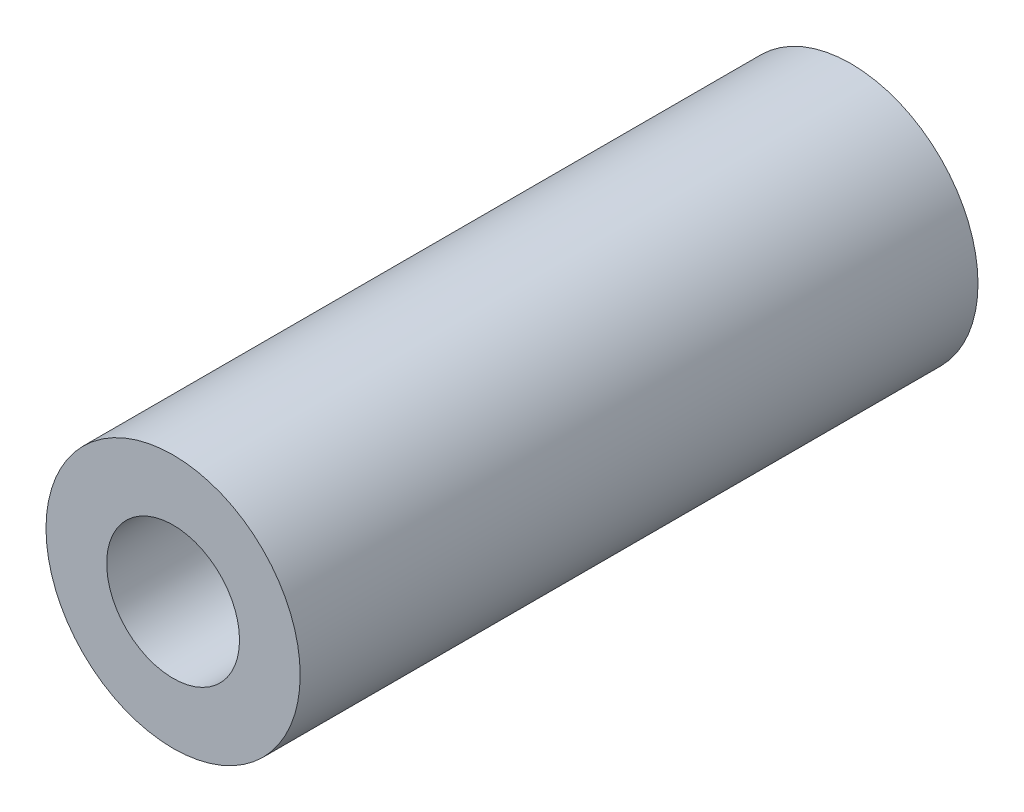
ISO-10303-21;
HEADER;
FILE_DESCRIPTION(('STEP AP214'),'2;1');
FILE_NAME('part.step','',(''),(''),'','','');
FILE_SCHEMA(('AUTOMOTIVE_DESIGN { 1 0 10303 214 1 1 1 1 }'));
ENDSEC;
DATA;
#1=APPLICATION_CONTEXT('core data for automotive mechanical design processes');
#2=APPLICATION_PROTOCOL_DEFINITION('international standard','automotive_design',2000,#1);
#3=PRODUCT_CONTEXT('',#1,'mechanical');
#4=PRODUCT('Part','Part','',(#3));
#5=PRODUCT_RELATED_PRODUCT_CATEGORY('part','',(#4));
#6=PRODUCT_DEFINITION_FORMATION('','',#4);
#7=PRODUCT_DEFINITION_CONTEXT('part definition',#1,'design');
#8=PRODUCT_DEFINITION('design','',#6,#7);
#9=PRODUCT_DEFINITION_SHAPE('','',#8);
#10=(LENGTH_UNIT() NAMED_UNIT(*) SI_UNIT(.MILLI.,.METRE.));
#11=(NAMED_UNIT(*) PLANE_ANGLE_UNIT() SI_UNIT($,.RADIAN.));
#12=(NAMED_UNIT(*) SI_UNIT($,.STERADIAN.) SOLID_ANGLE_UNIT());
#13=UNCERTAINTY_MEASURE_WITH_UNIT(LENGTH_MEASURE(1.E-05),#10,'distance_accuracy_value','');
#14=(GEOMETRIC_REPRESENTATION_CONTEXT(3) GLOBAL_UNCERTAINTY_ASSIGNED_CONTEXT((#13)) GLOBAL_UNIT_ASSIGNED_CONTEXT((#10,
#11,#12)) REPRESENTATION_CONTEXT('',''));
#15=CARTESIAN_POINT('',(0.,0.,0.));
#16=DIRECTION('',(0.,0.,1.));
#17=DIRECTION('',(1.,0.,0.));
#18=AXIS2_PLACEMENT_3D('',#15,#16,#17);
#19=CARTESIAN_POINT('',(0.,0.,25.4));
#20=DIRECTION('',(0.,0.,-1.));
#21=DIRECTION('',(-1.,0.,0.));
#22=AXIS2_PLACEMENT_3D('',#19,#20,#21);
#23=CYLINDRICAL_SURFACE('',#22,2.4892);
#24=CARTESIAN_POINT('',(0.,0.,25.4));
#25=DIRECTION('',(0.,0.,1.));
#26=DIRECTION('',(1.,0.,0.));
#27=AXIS2_PLACEMENT_3D('',#24,#25,#26);
#28=CIRCLE('',#27,2.4892);
#29=CARTESIAN_POINT('',(2.4892,0.,25.4));
#30=VERTEX_POINT('',#29);
#31=EDGE_CURVE('E53',#30,#30,#28,.T.);
#32=ORIENTED_EDGE('',*,*,#31,.T.);
#33=EDGE_LOOP('',(#32));
#34=FACE_BOUND('',#33,.T.);
#35=CARTESIAN_POINT('',(0.,0.,0.));
#36=DIRECTION('',(0.,0.,1.));
#37=DIRECTION('',(1.,0.,0.));
#38=AXIS2_PLACEMENT_3D('',#35,#36,#37);
#39=CIRCLE('',#38,2.4892);
#40=CARTESIAN_POINT('',(2.4892,0.,0.));
#41=VERTEX_POINT('',#40);
#42=EDGE_CURVE('E60',#41,#41,#39,.T.);
#43=ORIENTED_EDGE('',*,*,#42,.F.);
#44=EDGE_LOOP('',(#43));
#45=FACE_BOUND('',#44,.T.);
#46=ADVANCED_FACE('F45',(#34,#45),#23,.F.);
#47=CARTESIAN_POINT('',(0.,0.,25.4));
#48=DIRECTION('',(0.,0.,-1.));
#49=DIRECTION('',(-1.,0.,0.));
#50=AXIS2_PLACEMENT_3D('',#47,#48,#49);
#51=CYLINDRICAL_SURFACE('',#50,4.7625);
#52=CARTESIAN_POINT('',(0.,0.,25.4));
#53=DIRECTION('',(0.,0.,1.));
#54=DIRECTION('',(1.,0.,0.));
#55=AXIS2_PLACEMENT_3D('',#52,#53,#54);
#56=CIRCLE('',#55,4.7625);
#57=CARTESIAN_POINT('',(4.7625,0.,25.4));
#58=VERTEX_POINT('',#57);
#59=EDGE_CURVE('E10',#58,#58,#56,.T.);
#60=ORIENTED_EDGE('',*,*,#59,.F.);
#61=EDGE_LOOP('',(#60));
#62=FACE_BOUND('',#61,.T.);
#63=CARTESIAN_POINT('',(0.,0.,0.));
#64=DIRECTION('',(0.,0.,1.));
#65=DIRECTION('',(1.,0.,0.));
#66=AXIS2_PLACEMENT_3D('',#63,#64,#65);
#67=CIRCLE('',#66,4.7625);
#68=CARTESIAN_POINT('',(4.7625,0.,0.));
#69=VERTEX_POINT('',#68);
#70=EDGE_CURVE('E48',#69,#69,#67,.T.);
#71=ORIENTED_EDGE('',*,*,#70,.T.);
#72=EDGE_LOOP('',(#71));
#73=FACE_BOUND('',#72,.T.);
#74=ADVANCED_FACE('F69',(#62,#73),#51,.T.);
#75=CARTESIAN_POINT('',(0.,0.,25.4));
#76=DIRECTION('',(0.,0.,1.));
#77=DIRECTION('',(1.,0.,0.));
#78=AXIS2_PLACEMENT_3D('',#75,#76,#77);
#79=PLANE('',#78);
#80=ORIENTED_EDGE('',*,*,#31,.F.);
#81=EDGE_LOOP('',(#80));
#82=FACE_BOUND('',#81,.T.);
#83=ORIENTED_EDGE('',*,*,#59,.T.);
#84=EDGE_LOOP('',(#83));
#85=FACE_BOUND('',#84,.T.);
#86=ADVANCED_FACE('F73',(#82,#85),#79,.T.);
#87=CARTESIAN_POINT('',(0.,0.,0.));
#88=DIRECTION('',(0.,0.,1.));
#89=DIRECTION('',(1.,0.,0.));
#90=AXIS2_PLACEMENT_3D('',#87,#88,#89);
#91=PLANE('',#90);
#92=ORIENTED_EDGE('',*,*,#42,.T.);
#93=EDGE_LOOP('',(#92));
#94=FACE_BOUND('',#93,.T.);
#95=ORIENTED_EDGE('',*,*,#70,.F.);
#96=EDGE_LOOP('',(#95));
#97=FACE_BOUND('',#96,.T.);
#98=ADVANCED_FACE('F71',(#94,#97),#91,.F.);
#99=CLOSED_SHELL('',(#46,#74,#86,#98));
#100=MANIFOLD_SOLID_BREP('B2',#99);
#101=ADVANCED_BREP_SHAPE_REPRESENTATION('',(#18,#100),#14);
#102=SHAPE_DEFINITION_REPRESENTATION(#9,#101);
ENDSEC;
END-ISO-10303-21;
